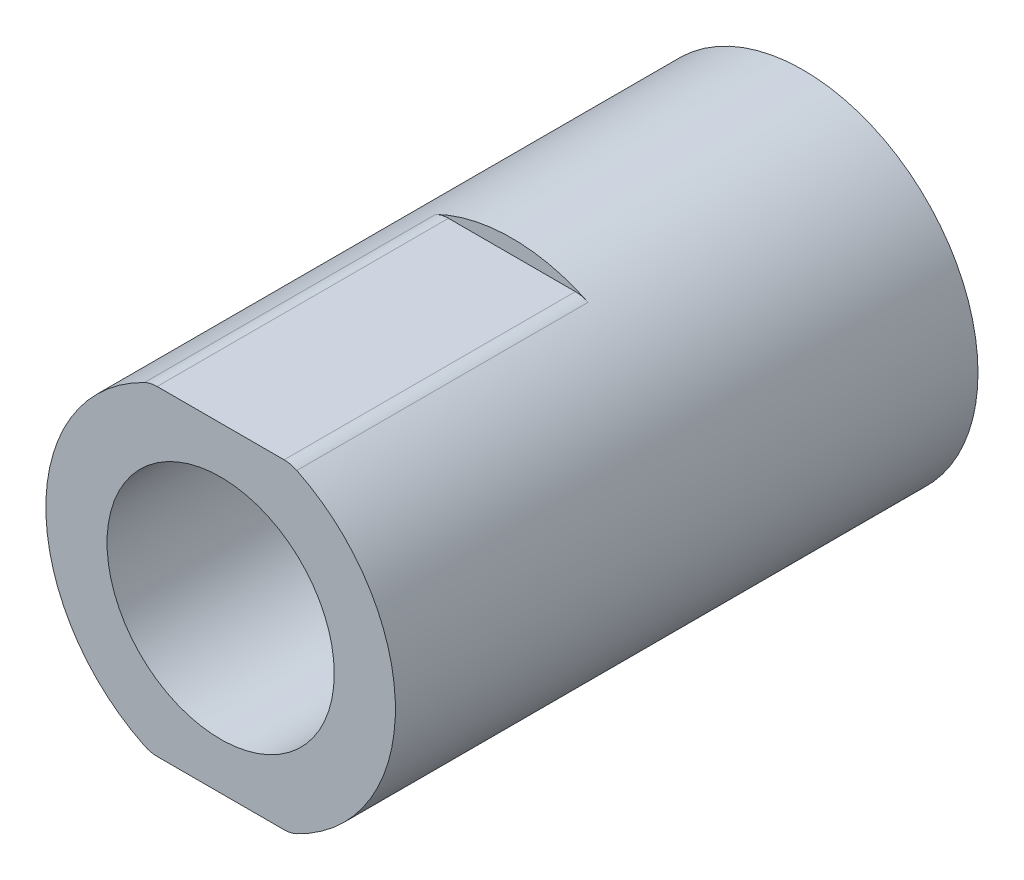
ISO-10303-21;
HEADER;
FILE_DESCRIPTION(('STEP AP214'),'2;1');
FILE_NAME('part.step','',(''),(''),'','','');
FILE_SCHEMA(('AUTOMOTIVE_DESIGN { 1 0 10303 214 1 1 1 1 }'));
ENDSEC;
DATA;
#1=APPLICATION_CONTEXT('core data for automotive mechanical design processes');
#2=APPLICATION_PROTOCOL_DEFINITION('international standard','automotive_design',2000,#1);
#3=PRODUCT_CONTEXT('',#1,'mechanical');
#4=PRODUCT('Part','Part','',(#3));
#5=PRODUCT_RELATED_PRODUCT_CATEGORY('part','',(#4));
#6=PRODUCT_DEFINITION_FORMATION('','',#4);
#7=PRODUCT_DEFINITION_CONTEXT('part definition',#1,'design');
#8=PRODUCT_DEFINITION('design','',#6,#7);
#9=PRODUCT_DEFINITION_SHAPE('','',#8);
#10=(LENGTH_UNIT() NAMED_UNIT(*) SI_UNIT(.MILLI.,.METRE.));
#11=(NAMED_UNIT(*) PLANE_ANGLE_UNIT() SI_UNIT($,.RADIAN.));
#12=(NAMED_UNIT(*) SI_UNIT($,.STERADIAN.) SOLID_ANGLE_UNIT());
#13=UNCERTAINTY_MEASURE_WITH_UNIT(LENGTH_MEASURE(1.E-05),#10,'distance_accuracy_value','');
#14=(GEOMETRIC_REPRESENTATION_CONTEXT(3) GLOBAL_UNCERTAINTY_ASSIGNED_CONTEXT((#13)) GLOBAL_UNIT_ASSIGNED_CONTEXT((#10,
#11,#12)) REPRESENTATION_CONTEXT('',''));
#15=CARTESIAN_POINT('',(0.,0.,0.));
#16=DIRECTION('',(0.,0.,1.));
#17=DIRECTION('',(1.,0.,0.));
#18=AXIS2_PLACEMENT_3D('',#15,#16,#17);
#19=CARTESIAN_POINT('',(0.,0.,20.));
#20=DIRECTION('',(0.,0.,-1.));
#21=DIRECTION('',(-1.,0.,0.));
#22=AXIS2_PLACEMENT_3D('',#19,#20,#21);
#23=CYLINDRICAL_SURFACE('',#22,2.4);
#24=CARTESIAN_POINT('',(0.,0.,0.));
#25=DIRECTION('',(0.,0.,1.));
#26=DIRECTION('',(1.,0.,0.));
#27=AXIS2_PLACEMENT_3D('',#24,#25,#26);
#28=CIRCLE('',#27,2.4);
#29=CARTESIAN_POINT('',(2.4,0.,0.));
#30=VERTEX_POINT('',#29);
#31=EDGE_CURVE('E175',#30,#30,#28,.T.);
#32=ORIENTED_EDGE('',*,*,#31,.F.);
#33=EDGE_LOOP('',(#32));
#34=FACE_BOUND('',#33,.T.);
#35=CARTESIAN_POINT('',(0.,0.,12.5));
#36=DIRECTION('',(0.,0.,1.));
#37=DIRECTION('',(1.,0.,0.));
#38=AXIS2_PLACEMENT_3D('',#35,#36,#37);
#39=CIRCLE('',#38,2.4);
#40=CARTESIAN_POINT('',(2.4,0.,12.5));
#41=VERTEX_POINT('',#40);
#42=EDGE_CURVE('E171',#41,#41,#39,.T.);
#43=ORIENTED_EDGE('',*,*,#42,.T.);
#44=EDGE_LOOP('',(#43));
#45=FACE_BOUND('',#44,.T.);
#46=ADVANCED_FACE('F32',(#34,#45),#23,.F.);
#47=CARTESIAN_POINT('',(0.,0.,20.));
#48=DIRECTION('',(0.,0.,1.));
#49=DIRECTION('',(1.,0.,0.));
#50=AXIS2_PLACEMENT_3D('',#47,#48,#49);
#51=PLANE('',#50);
#52=CARTESIAN_POINT('',(0.,0.,20.));
#53=DIRECTION('',(0.,0.,1.));
#54=DIRECTION('',(1.,0.,0.));
#55=AXIS2_PLACEMENT_3D('',#52,#53,#54);
#56=CIRCLE('',#55,6.);
#57=CARTESIAN_POINT('',(-2.61533936612441,5.4,20.));
#58=VERTEX_POINT('',#57);
#59=CARTESIAN_POINT('',(-2.61533936612441,-5.4,20.));
#60=VERTEX_POINT('',#59);
#61=EDGE_CURVE('E120',#58,#60,#56,.T.);
#62=ORIENTED_EDGE('',*,*,#61,.T.);
#63=CARTESIAN_POINT('',(-2.17944947177034,-4.5,20.));
#64=DIRECTION('',(0.,0.,1.));
#65=DIRECTION('',(1.,0.,0.));
#66=AXIS2_PLACEMENT_3D('',#63,#64,#65);
#67=CIRCLE('',#66,1.);
#68=CARTESIAN_POINT('',(-2.17944947177034,-5.5,20.));
#69=VERTEX_POINT('',#68);
#70=EDGE_CURVE('E108',#60,#69,#67,.T.);
#71=ORIENTED_EDGE('',*,*,#70,.T.);
#72=DIRECTION('',(-1.,0.,0.));
#73=VECTOR('',#72,1.);
#74=CARTESIAN_POINT('',(2.39791576165636,-5.5,20.));
#75=LINE('',#74,#73);
#76=CARTESIAN_POINT('',(2.17944947177034,-5.5,20.));
#77=VERTEX_POINT('',#76);
#78=EDGE_CURVE('E103',#77,#69,#75,.T.);
#79=ORIENTED_EDGE('',*,*,#78,.F.);
#80=CARTESIAN_POINT('',(2.17944947177034,-4.5,20.));
#81=DIRECTION('',(0.,0.,1.));
#82=DIRECTION('',(1.,0.,0.));
#83=AXIS2_PLACEMENT_3D('',#80,#81,#82);
#84=CIRCLE('',#83,1.);
#85=CARTESIAN_POINT('',(2.61533936612441,-5.4,20.));
#86=VERTEX_POINT('',#85);
#87=EDGE_CURVE('E96',#77,#86,#84,.T.);
#88=ORIENTED_EDGE('',*,*,#87,.T.);
#89=CARTESIAN_POINT('',(2.61533936612441,5.4,20.));
#90=VERTEX_POINT('',#89);
#91=EDGE_CURVE('E101',#86,#90,#56,.T.);
#92=ORIENTED_EDGE('',*,*,#91,.T.);
#93=CARTESIAN_POINT('',(2.17944947177034,4.5,20.));
#94=DIRECTION('',(0.,0.,1.));
#95=DIRECTION('',(1.,0.,0.));
#96=AXIS2_PLACEMENT_3D('',#93,#94,#95);
#97=CIRCLE('',#96,1.);
#98=CARTESIAN_POINT('',(2.17944947177034,5.5,20.));
#99=VERTEX_POINT('',#98);
#100=EDGE_CURVE('E109',#90,#99,#97,.T.);
#101=ORIENTED_EDGE('',*,*,#100,.T.);
#102=DIRECTION('',(1.,0.,0.));
#103=VECTOR('',#102,1.);
#104=CARTESIAN_POINT('',(-2.39791576165636,5.5,20.));
#105=LINE('',#104,#103);
#106=CARTESIAN_POINT('',(-2.17944947177034,5.5,20.));
#107=VERTEX_POINT('',#106);
#108=EDGE_CURVE('E157',#107,#99,#105,.T.);
#109=ORIENTED_EDGE('',*,*,#108,.F.);
#110=CARTESIAN_POINT('',(-2.17944947177034,4.5,20.));
#111=DIRECTION('',(0.,0.,1.));
#112=DIRECTION('',(1.,0.,0.));
#113=AXIS2_PLACEMENT_3D('',#110,#111,#112);
#114=CIRCLE('',#113,1.);
#115=EDGE_CURVE('E128',#107,#58,#114,.T.);
#116=ORIENTED_EDGE('',*,*,#115,.T.);
#117=EDGE_LOOP('',(#62,#71,#79,#88,#92,#101,#109,#116));
#118=FACE_BOUND('',#117,.T.);
#119=CARTESIAN_POINT('',(0.,0.,20.));
#120=DIRECTION('',(0.,0.,1.));
#121=DIRECTION('',(1.,0.,0.));
#122=AXIS2_PLACEMENT_3D('',#119,#120,#121);
#123=CIRCLE('',#122,3.9);
#124=CARTESIAN_POINT('',(3.9,0.,20.));
#125=VERTEX_POINT('',#124);
#126=EDGE_CURVE('E172',#125,#125,#123,.T.);
#127=ORIENTED_EDGE('',*,*,#126,.F.);
#128=EDGE_LOOP('',(#127));
#129=FACE_BOUND('',#128,.T.);
#130=ADVANCED_FACE('F99',(#118,#129),#51,.T.);
#131=CARTESIAN_POINT('',(0.,0.,0.));
#132=DIRECTION('',(0.,0.,1.));
#133=DIRECTION('',(1.,0.,0.));
#134=AXIS2_PLACEMENT_3D('',#131,#132,#133);
#135=PLANE('',#134);
#136=CARTESIAN_POINT('',(0.,0.,0.));
#137=DIRECTION('',(0.,0.,1.));
#138=DIRECTION('',(1.,0.,0.));
#139=AXIS2_PLACEMENT_3D('',#136,#137,#138);
#140=CIRCLE('',#139,6.);
#141=CARTESIAN_POINT('',(6.,0.,0.));
#142=VERTEX_POINT('',#141);
#143=EDGE_CURVE('E121',#142,#142,#140,.T.);
#144=ORIENTED_EDGE('',*,*,#143,.F.);
#145=EDGE_LOOP('',(#144));
#146=FACE_BOUND('',#145,.T.);
#147=ORIENTED_EDGE('',*,*,#31,.T.);
#148=EDGE_LOOP('',(#147));
#149=FACE_BOUND('',#148,.T.);
#150=ADVANCED_FACE('F210',(#146,#149),#135,.F.);
#151=CARTESIAN_POINT('',(0.,0.,20.));
#152=DIRECTION('',(0.,0.,-1.));
#153=DIRECTION('',(-1.,0.,0.));
#154=AXIS2_PLACEMENT_3D('',#151,#152,#153);
#155=CYLINDRICAL_SURFACE('',#154,6.);
#156=CARTESIAN_POINT('',(0.,0.,10.));
#157=DIRECTION('',(0.,0.,1.));
#158=DIRECTION('',(-1.,0.,0.));
#159=AXIS2_PLACEMENT_3D('',#156,#157,#158);
#160=CIRCLE('',#159,6.);
#161=CARTESIAN_POINT('',(-2.61533936612441,-5.4,10.));
#162=VERTEX_POINT('',#161);
#163=CARTESIAN_POINT('',(2.61533936612441,-5.4,10.));
#164=VERTEX_POINT('',#163);
#165=EDGE_CURVE('E164',#162,#164,#160,.T.);
#166=ORIENTED_EDGE('',*,*,#165,.F.);
#167=DIRECTION('',(0.,0.,-1.));
#168=VECTOR('',#167,1.);
#169=CARTESIAN_POINT('',(-2.61533936612441,-5.4,20.));
#170=LINE('',#169,#168);
#171=EDGE_CURVE('E125',#162,#60,#170,.F.);
#172=ORIENTED_EDGE('',*,*,#171,.T.);
#173=ORIENTED_EDGE('',*,*,#61,.F.);
#174=DIRECTION('',(0.,0.,-1.));
#175=VECTOR('',#174,1.);
#176=CARTESIAN_POINT('',(-2.61533936612441,5.4,20.));
#177=LINE('',#176,#175);
#178=CARTESIAN_POINT('',(-2.61533936612441,5.4,10.));
#179=VERTEX_POINT('',#178);
#180=EDGE_CURVE('E130',#58,#179,#177,.T.);
#181=ORIENTED_EDGE('',*,*,#180,.T.);
#182=CARTESIAN_POINT('',(0.,0.,10.));
#183=DIRECTION('',(0.,0.,1.));
#184=DIRECTION('',(1.,0.,0.));
#185=AXIS2_PLACEMENT_3D('',#182,#183,#184);
#186=CIRCLE('',#185,6.);
#187=CARTESIAN_POINT('',(2.61533936612441,5.4,10.));
#188=VERTEX_POINT('',#187);
#189=EDGE_CURVE('E151',#188,#179,#186,.T.);
#190=ORIENTED_EDGE('',*,*,#189,.F.);
#191=DIRECTION('',(0.,0.,-1.));
#192=VECTOR('',#191,1.);
#193=CARTESIAN_POINT('',(2.61533936612441,5.4,20.));
#194=LINE('',#193,#192);
#195=EDGE_CURVE('E119',#188,#90,#194,.F.);
#196=ORIENTED_EDGE('',*,*,#195,.T.);
#197=ORIENTED_EDGE('',*,*,#91,.F.);
#198=DIRECTION('',(0.,0.,-1.));
#199=VECTOR('',#198,1.);
#200=CARTESIAN_POINT('',(2.61533936612441,-5.4,20.));
#201=LINE('',#200,#199);
#202=EDGE_CURVE('E116',#86,#164,#201,.T.);
#203=ORIENTED_EDGE('',*,*,#202,.T.);
#204=EDGE_LOOP('',(#166,#172,#173,#181,#190,#196,#197,#203));
#205=FACE_BOUND('',#204,.T.);
#206=ORIENTED_EDGE('',*,*,#143,.T.);
#207=EDGE_LOOP('',(#206));
#208=FACE_BOUND('',#207,.T.);
#209=ADVANCED_FACE('F114',(#205,#208),#155,.T.);
#210=CARTESIAN_POINT('',(0.,0.,12.5));
#211=DIRECTION('',(0.,0.,1.));
#212=DIRECTION('',(1.,0.,0.));
#213=AXIS2_PLACEMENT_3D('',#210,#211,#212);
#214=CYLINDRICAL_SURFACE('',#213,3.9);
#215=CARTESIAN_POINT('',(0.,0.,12.5));
#216=DIRECTION('',(0.,0.,1.));
#217=DIRECTION('',(1.,0.,0.));
#218=AXIS2_PLACEMENT_3D('',#215,#216,#217);
#219=CIRCLE('',#218,3.9);
#220=CARTESIAN_POINT('',(3.9,0.,12.5));
#221=VERTEX_POINT('',#220);
#222=EDGE_CURVE('E168',#221,#221,#219,.T.);
#223=ORIENTED_EDGE('',*,*,#222,.F.);
#224=EDGE_LOOP('',(#223));
#225=FACE_BOUND('',#224,.T.);
#226=ORIENTED_EDGE('',*,*,#126,.T.);
#227=EDGE_LOOP('',(#226));
#228=FACE_BOUND('',#227,.T.);
#229=ADVANCED_FACE('F215',(#225,#228),#214,.F.);
#230=CARTESIAN_POINT('',(0.,0.,12.5));
#231=DIRECTION('',(0.,0.,1.));
#232=DIRECTION('',(1.,0.,0.));
#233=AXIS2_PLACEMENT_3D('',#230,#231,#232);
#234=PLANE('',#233);
#235=ORIENTED_EDGE('',*,*,#42,.F.);
#236=EDGE_LOOP('',(#235));
#237=FACE_BOUND('',#236,.T.);
#238=ORIENTED_EDGE('',*,*,#222,.T.);
#239=EDGE_LOOP('',(#238));
#240=FACE_BOUND('',#239,.T.);
#241=ADVANCED_FACE('F273',(#237,#240),#234,.T.);
#242=CARTESIAN_POINT('',(-2.39791576165636,5.5,10.));
#243=DIRECTION('',(0.,-1.,0.));
#244=DIRECTION('',(0.,0.,-1.));
#245=AXIS2_PLACEMENT_3D('',#242,#243,#244);
#246=PLANE('',#245);
#247=ORIENTED_EDGE('',*,*,#108,.T.);
#248=DIRECTION('',(0.,0.,-1.));
#249=VECTOR('',#248,1.);
#250=CARTESIAN_POINT('',(2.17944947177034,5.5,10.));
#251=LINE('',#250,#249);
#252=CARTESIAN_POINT('',(2.17944947177034,5.5,10.));
#253=VERTEX_POINT('',#252);
#254=EDGE_CURVE('E47',#99,#253,#251,.T.);
#255=ORIENTED_EDGE('',*,*,#254,.T.);
#256=DIRECTION('',(1.,0.,0.));
#257=VECTOR('',#256,1.);
#258=CARTESIAN_POINT('',(-2.39791576165636,5.5,10.));
#259=LINE('',#258,#257);
#260=CARTESIAN_POINT('',(-2.17944947177034,5.5,10.));
#261=VERTEX_POINT('',#260);
#262=EDGE_CURVE('E153',#261,#253,#259,.T.);
#263=ORIENTED_EDGE('',*,*,#262,.F.);
#264=DIRECTION('',(0.,0.,-1.));
#265=VECTOR('',#264,1.);
#266=CARTESIAN_POINT('',(-2.17944947177034,5.5,10.));
#267=LINE('',#266,#265);
#268=EDGE_CURVE('E141',#261,#107,#267,.F.);
#269=ORIENTED_EDGE('',*,*,#268,.T.);
#270=EDGE_LOOP('',(#247,#255,#263,#269));
#271=FACE_BOUND('',#270,.T.);
#272=ADVANCED_FACE('F158',(#271),#246,.F.);
#273=CARTESIAN_POINT('',(0.,0.,10.));
#274=DIRECTION('',(0.,0.,1.));
#275=DIRECTION('',(1.,0.,0.));
#276=AXIS2_PLACEMENT_3D('',#273,#274,#275);
#277=PLANE('',#276);
#278=ORIENTED_EDGE('',*,*,#189,.T.);
#279=CARTESIAN_POINT('',(-2.17944947177034,4.5,10.));
#280=DIRECTION('',(0.,0.,1.));
#281=DIRECTION('',(1.,0.,0.));
#282=AXIS2_PLACEMENT_3D('',#279,#280,#281);
#283=CIRCLE('',#282,1.);
#284=EDGE_CURVE('E11',#179,#261,#283,.F.);
#285=ORIENTED_EDGE('',*,*,#284,.T.);
#286=ORIENTED_EDGE('',*,*,#262,.T.);
#287=CARTESIAN_POINT('',(2.17944947177034,4.5,10.));
#288=DIRECTION('',(0.,0.,1.));
#289=DIRECTION('',(1.,0.,0.));
#290=AXIS2_PLACEMENT_3D('',#287,#288,#289);
#291=CIRCLE('',#290,1.);
#292=EDGE_CURVE('E40',#253,#188,#291,.F.);
#293=ORIENTED_EDGE('',*,*,#292,.T.);
#294=EDGE_LOOP('',(#278,#285,#286,#293));
#295=FACE_BOUND('',#294,.T.);
#296=ADVANCED_FACE('F150',(#295),#277,.T.);
#297=CARTESIAN_POINT('',(2.39791576165636,-5.5,10.));
#298=DIRECTION('',(0.,1.,0.));
#299=DIRECTION('',(0.,0.,1.));
#300=AXIS2_PLACEMENT_3D('',#297,#298,#299);
#301=PLANE('',#300);
#302=ORIENTED_EDGE('',*,*,#78,.T.);
#303=DIRECTION('',(0.,0.,-1.));
#304=VECTOR('',#303,1.);
#305=CARTESIAN_POINT('',(-2.17944947177034,-5.5,10.));
#306=LINE('',#305,#304);
#307=CARTESIAN_POINT('',(-2.17944947177034,-5.5,10.));
#308=VERTEX_POINT('',#307);
#309=EDGE_CURVE('E139',#69,#308,#306,.T.);
#310=ORIENTED_EDGE('',*,*,#309,.T.);
#311=DIRECTION('',(-1.,0.,0.));
#312=VECTOR('',#311,1.);
#313=CARTESIAN_POINT('',(2.39791576165636,-5.5,10.));
#314=LINE('',#313,#312);
#315=CARTESIAN_POINT('',(2.17944947177034,-5.5,10.));
#316=VERTEX_POINT('',#315);
#317=EDGE_CURVE('E160',#316,#308,#314,.T.);
#318=ORIENTED_EDGE('',*,*,#317,.F.);
#319=DIRECTION('',(0.,0.,-1.));
#320=VECTOR('',#319,1.);
#321=CARTESIAN_POINT('',(2.17944947177034,-5.5,10.));
#322=LINE('',#321,#320);
#323=EDGE_CURVE('E137',#316,#77,#322,.F.);
#324=ORIENTED_EDGE('',*,*,#323,.T.);
#325=EDGE_LOOP('',(#302,#310,#318,#324));
#326=FACE_BOUND('',#325,.T.);
#327=ADVANCED_FACE('F188',(#326),#301,.F.);
#328=CARTESIAN_POINT('',(0.,0.,10.));
#329=DIRECTION('',(0.,0.,-1.));
#330=DIRECTION('',(-1.,0.,0.));
#331=AXIS2_PLACEMENT_3D('',#328,#329,#330);
#332=PLANE('',#331);
#333=ORIENTED_EDGE('',*,*,#165,.T.);
#334=CARTESIAN_POINT('',(2.17944947177034,-4.5,10.));
#335=DIRECTION('',(0.,0.,-1.));
#336=DIRECTION('',(-1.,0.,0.));
#337=AXIS2_PLACEMENT_3D('',#334,#335,#336);
#338=CIRCLE('',#337,1.);
#339=EDGE_CURVE('E124',#164,#316,#338,.T.);
#340=ORIENTED_EDGE('',*,*,#339,.T.);
#341=ORIENTED_EDGE('',*,*,#317,.T.);
#342=CARTESIAN_POINT('',(-2.17944947177034,-4.5,10.));
#343=DIRECTION('',(0.,0.,-1.));
#344=DIRECTION('',(-1.,0.,0.));
#345=AXIS2_PLACEMENT_3D('',#342,#343,#344);
#346=CIRCLE('',#345,1.);
#347=EDGE_CURVE('E145',#308,#162,#346,.T.);
#348=ORIENTED_EDGE('',*,*,#347,.T.);
#349=EDGE_LOOP('',(#333,#340,#341,#348));
#350=FACE_BOUND('',#349,.T.);
#351=ADVANCED_FACE('F194',(#350),#332,.F.);
#352=CARTESIAN_POINT('',(-2.17944947177034,-4.5,20.));
#353=DIRECTION('',(0.,0.,-1.));
#354=DIRECTION('',(-1.,0.,0.));
#355=AXIS2_PLACEMENT_3D('',#352,#353,#354);
#356=CYLINDRICAL_SURFACE('',#355,1.);
#357=ORIENTED_EDGE('',*,*,#347,.F.);
#358=ORIENTED_EDGE('',*,*,#309,.F.);
#359=ORIENTED_EDGE('',*,*,#70,.F.);
#360=ORIENTED_EDGE('',*,*,#171,.F.);
#361=EDGE_LOOP('',(#357,#358,#359,#360));
#362=FACE_BOUND('',#361,.T.);
#363=ADVANCED_FACE('F192',(#362),#356,.T.);
#364=CARTESIAN_POINT('',(2.17944947177034,-4.5,20.));
#365=DIRECTION('',(0.,0.,-1.));
#366=DIRECTION('',(-1.,0.,0.));
#367=AXIS2_PLACEMENT_3D('',#364,#365,#366);
#368=CYLINDRICAL_SURFACE('',#367,1.);
#369=ORIENTED_EDGE('',*,*,#339,.F.);
#370=ORIENTED_EDGE('',*,*,#202,.F.);
#371=ORIENTED_EDGE('',*,*,#87,.F.);
#372=ORIENTED_EDGE('',*,*,#323,.F.);
#373=EDGE_LOOP('',(#369,#370,#371,#372));
#374=FACE_BOUND('',#373,.T.);
#375=ADVANCED_FACE('F123',(#374),#368,.T.);
#376=CARTESIAN_POINT('',(2.17944947177034,4.5,20.));
#377=DIRECTION('',(0.,0.,-1.));
#378=DIRECTION('',(-1.,0.,0.));
#379=AXIS2_PLACEMENT_3D('',#376,#377,#378);
#380=CYLINDRICAL_SURFACE('',#379,1.);
#381=ORIENTED_EDGE('',*,*,#292,.F.);
#382=ORIENTED_EDGE('',*,*,#254,.F.);
#383=ORIENTED_EDGE('',*,*,#100,.F.);
#384=ORIENTED_EDGE('',*,*,#195,.F.);
#385=EDGE_LOOP('',(#381,#382,#383,#384));
#386=FACE_BOUND('',#385,.T.);
#387=ADVANCED_FACE('F155',(#386),#380,.T.);
#388=CARTESIAN_POINT('',(-2.17944947177034,4.5,20.));
#389=DIRECTION('',(0.,0.,-1.));
#390=DIRECTION('',(-1.,0.,0.));
#391=AXIS2_PLACEMENT_3D('',#388,#389,#390);
#392=CYLINDRICAL_SURFACE('',#391,1.);
#393=ORIENTED_EDGE('',*,*,#284,.F.);
#394=ORIENTED_EDGE('',*,*,#180,.F.);
#395=ORIENTED_EDGE('',*,*,#115,.F.);
#396=ORIENTED_EDGE('',*,*,#268,.F.);
#397=EDGE_LOOP('',(#393,#394,#395,#396));
#398=FACE_BOUND('',#397,.T.);
#399=ADVANCED_FACE('F34',(#398),#392,.T.);
#400=CLOSED_SHELL('',(#46,#130,#150,#209,#229,#241,#272,#296,#327,#351,#363,#375,#387,#399));
#401=MANIFOLD_SOLID_BREP('B2',#400);
#402=ADVANCED_BREP_SHAPE_REPRESENTATION('',(#18,#401),#14);
#403=SHAPE_DEFINITION_REPRESENTATION(#9,#402);
ENDSEC;
END-ISO-10303-21;
